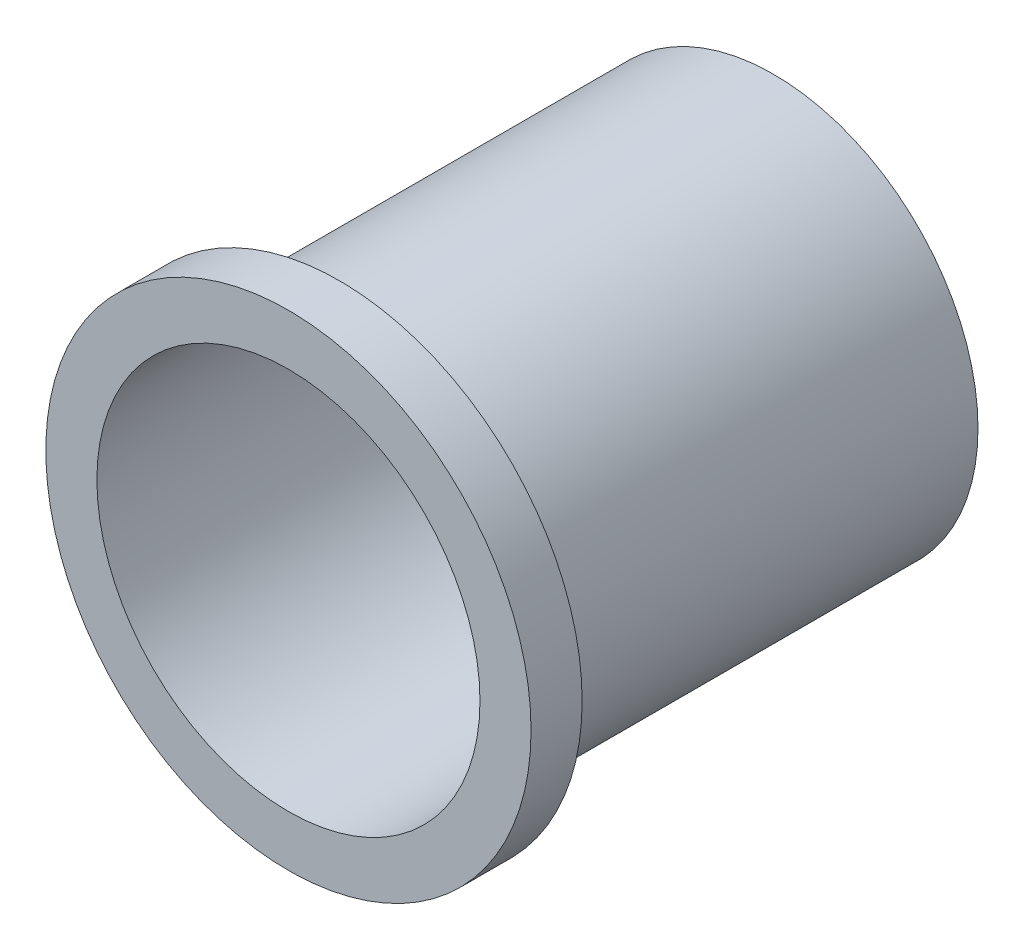
ISO-10303-21;
HEADER;
FILE_DESCRIPTION(('STEP AP214'),'2;1');
FILE_NAME('part.step','',(''),(''),'','','');
FILE_SCHEMA(('AUTOMOTIVE_DESIGN { 1 0 10303 214 1 1 1 1 }'));
ENDSEC;
DATA;
#1=APPLICATION_CONTEXT('core data for automotive mechanical design processes');
#2=APPLICATION_PROTOCOL_DEFINITION('international standard','automotive_design',2000,#1);
#3=PRODUCT_CONTEXT('',#1,'mechanical');
#4=PRODUCT('Part','Part','',(#3));
#5=PRODUCT_RELATED_PRODUCT_CATEGORY('part','',(#4));
#6=PRODUCT_DEFINITION_FORMATION('','',#4);
#7=PRODUCT_DEFINITION_CONTEXT('part definition',#1,'design');
#8=PRODUCT_DEFINITION('design','',#6,#7);
#9=PRODUCT_DEFINITION_SHAPE('','',#8);
#10=(LENGTH_UNIT() NAMED_UNIT(*) SI_UNIT(.MILLI.,.METRE.));
#11=(NAMED_UNIT(*) PLANE_ANGLE_UNIT() SI_UNIT($,.RADIAN.));
#12=(NAMED_UNIT(*) SI_UNIT($,.STERADIAN.) SOLID_ANGLE_UNIT());
#13=UNCERTAINTY_MEASURE_WITH_UNIT(LENGTH_MEASURE(1.E-05),#10,'distance_accuracy_value','');
#14=(GEOMETRIC_REPRESENTATION_CONTEXT(3) GLOBAL_UNCERTAINTY_ASSIGNED_CONTEXT((#13)) GLOBAL_UNIT_ASSIGNED_CONTEXT((#10,
#11,#12)) REPRESENTATION_CONTEXT('',''));
#15=CARTESIAN_POINT('',(0.,0.,0.));
#16=DIRECTION('',(0.,0.,1.));
#17=DIRECTION('',(1.,0.,0.));
#18=AXIS2_PLACEMENT_3D('',#15,#16,#17);
#19=CARTESIAN_POINT('',(0.,0.,20.));
#20=DIRECTION('',(0.,0.,1.));
#21=DIRECTION('',(1.,0.,0.));
#22=AXIS2_PLACEMENT_3D('',#19,#20,#21);
#23=PLANE('',#22);
#24=CARTESIAN_POINT('',(0.,0.,20.));
#25=DIRECTION('',(0.,0.,1.));
#26=DIRECTION('',(1.,0.,0.));
#27=AXIS2_PLACEMENT_3D('',#24,#25,#26);
#28=CIRCLE('',#27,75.);
#29=CARTESIAN_POINT('',(75.,0.,20.));
#30=VERTEX_POINT('',#29);
#31=EDGE_CURVE('E41',#30,#30,#28,.F.);
#32=ORIENTED_EDGE('',*,*,#31,.F.);
#33=EDGE_LOOP('',(#32));
#34=FACE_BOUND('',#33,.T.);
#35=CARTESIAN_POINT('',(0.,0.,20.));
#36=DIRECTION('',(0.,0.,1.));
#37=DIRECTION('',(1.,0.,0.));
#38=AXIS2_PLACEMENT_3D('',#35,#36,#37);
#39=CIRCLE('',#38,15.);
#40=CARTESIAN_POINT('',(15.,0.,20.));
#41=VERTEX_POINT('',#40);
#42=EDGE_CURVE('E50',#41,#41,#39,.T.);
#43=ORIENTED_EDGE('',*,*,#42,.F.);
#44=EDGE_LOOP('',(#43));
#45=FACE_BOUND('',#44,.T.);
#46=ADVANCED_FACE('F30',(#34,#45),#23,.T.);
#47=CARTESIAN_POINT('',(0.,0.,0.));
#48=DIRECTION('',(0.,0.,1.));
#49=DIRECTION('',(1.,0.,0.));
#50=AXIS2_PLACEMENT_3D('',#47,#48,#49);
#51=PLANE('',#50);
#52=CARTESIAN_POINT('',(0.,0.,0.));
#53=DIRECTION('',(0.,0.,1.));
#54=DIRECTION('',(1.,0.,0.));
#55=AXIS2_PLACEMENT_3D('',#52,#53,#54);
#56=CIRCLE('',#55,80.);
#57=CARTESIAN_POINT('',(80.,0.,0.));
#58=VERTEX_POINT('',#57);
#59=EDGE_CURVE('E45',#58,#58,#56,.T.);
#60=ORIENTED_EDGE('',*,*,#59,.F.);
#61=EDGE_LOOP('',(#60));
#62=FACE_BOUND('',#61,.T.);
#63=CARTESIAN_POINT('',(0.,0.,0.));
#64=DIRECTION('',(0.,0.,1.));
#65=DIRECTION('',(1.,0.,0.));
#66=AXIS2_PLACEMENT_3D('',#63,#64,#65);
#67=CIRCLE('',#66,15.);
#68=CARTESIAN_POINT('',(15.,0.,0.));
#69=VERTEX_POINT('',#68);
#70=EDGE_CURVE('E51',#69,#69,#67,.T.);
#71=ORIENTED_EDGE('',*,*,#70,.T.);
#72=EDGE_LOOP('',(#71));
#73=FACE_BOUND('',#72,.T.);
#74=ADVANCED_FACE('F82',(#62,#73),#51,.F.);
#75=CARTESIAN_POINT('',(0.,0.,20.));
#76=DIRECTION('',(0.,0.,-1.));
#77=DIRECTION('',(-1.,0.,0.));
#78=AXIS2_PLACEMENT_3D('',#75,#76,#77);
#79=CYLINDRICAL_SURFACE('',#78,80.);
#80=CARTESIAN_POINT('',(0.,0.,160.));
#81=DIRECTION('',(0.,0.,1.));
#82=DIRECTION('',(1.,0.,0.));
#83=AXIS2_PLACEMENT_3D('',#80,#81,#82);
#84=CIRCLE('',#83,80.);
#85=CARTESIAN_POINT('',(80.,0.,160.));
#86=VERTEX_POINT('',#85);
#87=EDGE_CURVE('E10',#86,#86,#84,.F.);
#88=ORIENTED_EDGE('',*,*,#87,.T.);
#89=EDGE_LOOP('',(#88));
#90=FACE_BOUND('',#89,.T.);
#91=ORIENTED_EDGE('',*,*,#59,.T.);
#92=EDGE_LOOP('',(#91));
#93=FACE_BOUND('',#92,.T.);
#94=ADVANCED_FACE('F88',(#90,#93),#79,.T.);
#95=CARTESIAN_POINT('',(0.,0.,20.));
#96=DIRECTION('',(0.,0.,-1.));
#97=DIRECTION('',(-1.,0.,0.));
#98=AXIS2_PLACEMENT_3D('',#95,#96,#97);
#99=CYLINDRICAL_SURFACE('',#98,15.);
#100=ORIENTED_EDGE('',*,*,#42,.T.);
#101=EDGE_LOOP('',(#100));
#102=FACE_BOUND('',#101,.T.);
#103=ORIENTED_EDGE('',*,*,#70,.F.);
#104=EDGE_LOOP('',(#103));
#105=FACE_BOUND('',#104,.T.);
#106=ADVANCED_FACE('F94',(#102,#105),#99,.F.);
#107=CARTESIAN_POINT('',(0.,0.,170.));
#108=DIRECTION('',(0.,0.,-1.));
#109=DIRECTION('',(-1.,0.,0.));
#110=AXIS2_PLACEMENT_3D('',#107,#108,#109);
#111=CYLINDRICAL_SURFACE('',#110,75.);
#112=ORIENTED_EDGE('',*,*,#31,.T.);
#113=EDGE_LOOP('',(#112));
#114=FACE_BOUND('',#113,.T.);
#115=CARTESIAN_POINT('',(0.,0.,190.));
#116=DIRECTION('',(0.,0.,1.));
#117=DIRECTION('',(1.,0.,0.));
#118=AXIS2_PLACEMENT_3D('',#115,#116,#117);
#119=CIRCLE('',#118,75.);
#120=CARTESIAN_POINT('',(75.,0.,190.));
#121=VERTEX_POINT('',#120);
#122=EDGE_CURVE('E60',#121,#121,#119,.T.);
#123=ORIENTED_EDGE('',*,*,#122,.T.);
#124=EDGE_LOOP('',(#123));
#125=FACE_BOUND('',#124,.T.);
#126=ADVANCED_FACE('F66',(#114,#125),#111,.F.);
#127=CARTESIAN_POINT('',(0.,0.,170.));
#128=DIRECTION('',(0.,0.,1.));
#129=DIRECTION('',(1.,0.,0.));
#130=AXIS2_PLACEMENT_3D('',#127,#128,#129);
#131=PLANE('',#130);
#132=CARTESIAN_POINT('',(0.,0.,170.));
#133=DIRECTION('',(0.,0.,1.));
#134=DIRECTION('',(1.,0.,0.));
#135=AXIS2_PLACEMENT_3D('',#132,#133,#134);
#136=CIRCLE('',#135,90.);
#137=CARTESIAN_POINT('',(90.,0.,170.));
#138=VERTEX_POINT('',#137);
#139=EDGE_CURVE('E37',#138,#138,#136,.T.);
#140=ORIENTED_EDGE('',*,*,#139,.T.);
#141=EDGE_LOOP('',(#140));
#142=FACE_BOUND('',#141,.T.);
#143=CARTESIAN_POINT('',(0.,0.,170.));
#144=DIRECTION('',(0.,0.,1.));
#145=DIRECTION('',(1.,0.,0.));
#146=AXIS2_PLACEMENT_3D('',#143,#144,#145);
#147=CIRCLE('',#146,95.);
#148=CARTESIAN_POINT('',(95.,0.,170.));
#149=VERTEX_POINT('',#148);
#150=EDGE_CURVE('E57',#149,#149,#147,.T.);
#151=ORIENTED_EDGE('',*,*,#150,.F.);
#152=EDGE_LOOP('',(#151));
#153=FACE_BOUND('',#152,.T.);
#154=ADVANCED_FACE('F71',(#142,#153),#131,.F.);
#155=CARTESIAN_POINT('',(0.,0.,190.));
#156=DIRECTION('',(0.,0.,1.));
#157=DIRECTION('',(1.,0.,0.));
#158=AXIS2_PLACEMENT_3D('',#155,#156,#157);
#159=PLANE('',#158);
#160=CARTESIAN_POINT('',(0.,0.,190.));
#161=DIRECTION('',(0.,0.,1.));
#162=DIRECTION('',(1.,0.,0.));
#163=AXIS2_PLACEMENT_3D('',#160,#161,#162);
#164=CIRCLE('',#163,95.);
#165=CARTESIAN_POINT('',(95.,0.,190.));
#166=VERTEX_POINT('',#165);
#167=EDGE_CURVE('E54',#166,#166,#164,.T.);
#168=ORIENTED_EDGE('',*,*,#167,.T.);
#169=EDGE_LOOP('',(#168));
#170=FACE_BOUND('',#169,.T.);
#171=ORIENTED_EDGE('',*,*,#122,.F.);
#172=EDGE_LOOP('',(#171));
#173=FACE_BOUND('',#172,.T.);
#174=ADVANCED_FACE('F68',(#170,#173),#159,.T.);
#175=CARTESIAN_POINT('',(0.,0.,190.));
#176=DIRECTION('',(0.,0.,-1.));
#177=DIRECTION('',(-1.,0.,0.));
#178=AXIS2_PLACEMENT_3D('',#175,#176,#177);
#179=CYLINDRICAL_SURFACE('',#178,95.);
#180=ORIENTED_EDGE('',*,*,#167,.F.);
#181=EDGE_LOOP('',(#180));
#182=FACE_BOUND('',#181,.T.);
#183=ORIENTED_EDGE('',*,*,#150,.T.);
#184=EDGE_LOOP('',(#183));
#185=FACE_BOUND('',#184,.T.);
#186=ADVANCED_FACE('F70',(#182,#185),#179,.T.);
#187=CARTESIAN_POINT('',(0.,0.,160.));
#188=DIRECTION('',(0.,0.,1.));
#189=DIRECTION('',(1.,0.,0.));
#190=AXIS2_PLACEMENT_3D('',#187,#188,#189);
#191=TOROIDAL_SURFACE('',#190,90.,10.);
#192=ORIENTED_EDGE('',*,*,#87,.F.);
#193=EDGE_LOOP('',(#192));
#194=FACE_BOUND('',#193,.T.);
#195=ORIENTED_EDGE('',*,*,#139,.F.);
#196=EDGE_LOOP('',(#195));
#197=FACE_BOUND('',#196,.T.);
#198=ADVANCED_FACE('F32',(#194,#197),#191,.F.);
#199=CLOSED_SHELL('',(#46,#74,#94,#106,#126,#154,#174,#186,#198));
#200=MANIFOLD_SOLID_BREP('B2',#199);
#201=ADVANCED_BREP_SHAPE_REPRESENTATION('',(#18,#200),#14);
#202=SHAPE_DEFINITION_REPRESENTATION(#9,#201);
ENDSEC;
END-ISO-10303-21;
